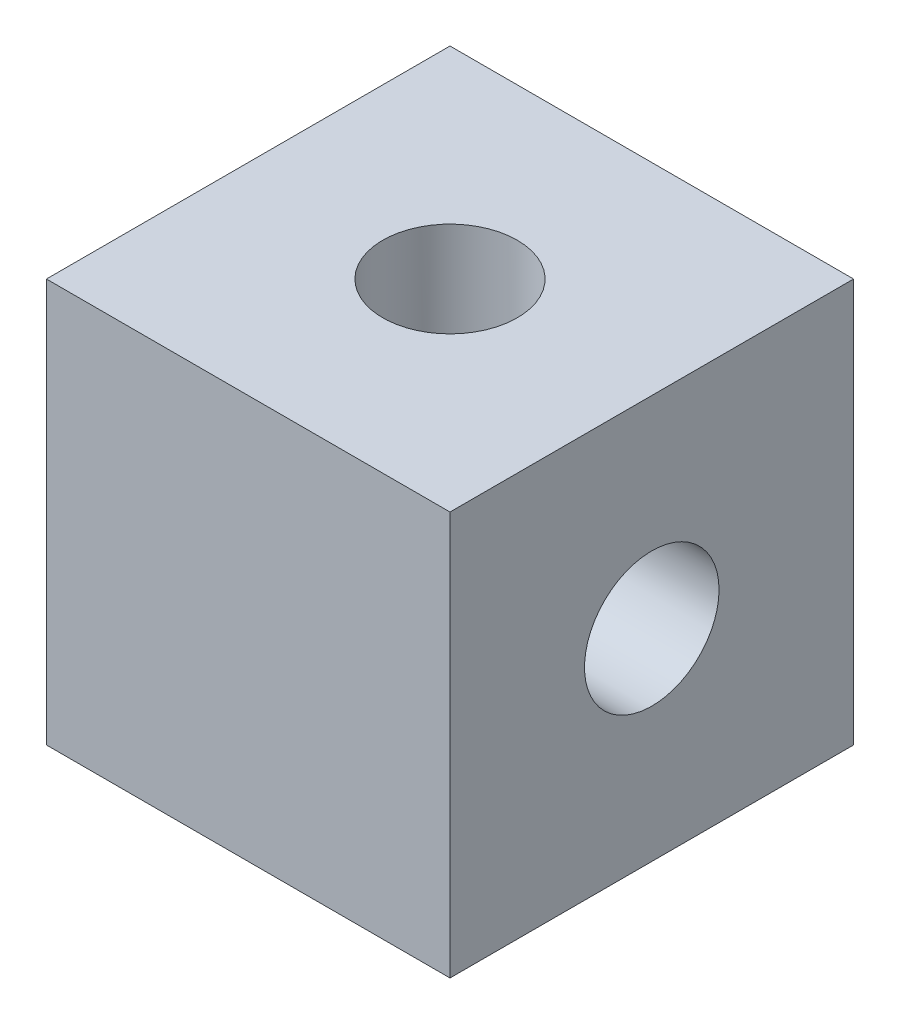
ISO-10303-21;
HEADER;
FILE_DESCRIPTION(('STEP AP214'),'2;1');
FILE_NAME('part.step','',(''),(''),'','','');
FILE_SCHEMA(('AUTOMOTIVE_DESIGN { 1 0 10303 214 1 1 1 1 }'));
ENDSEC;
DATA;
#1=APPLICATION_CONTEXT('core data for automotive mechanical design processes');
#2=APPLICATION_PROTOCOL_DEFINITION('international standard','automotive_design',2000,#1);
#3=PRODUCT_CONTEXT('',#1,'mechanical');
#4=PRODUCT('Part','Part','',(#3));
#5=PRODUCT_RELATED_PRODUCT_CATEGORY('part','',(#4));
#6=PRODUCT_DEFINITION_FORMATION('','',#4);
#7=PRODUCT_DEFINITION_CONTEXT('part definition',#1,'design');
#8=PRODUCT_DEFINITION('design','',#6,#7);
#9=PRODUCT_DEFINITION_SHAPE('','',#8);
#10=(LENGTH_UNIT() NAMED_UNIT(*) SI_UNIT(.MILLI.,.METRE.));
#11=(NAMED_UNIT(*) PLANE_ANGLE_UNIT() SI_UNIT($,.RADIAN.));
#12=(NAMED_UNIT(*) SI_UNIT($,.STERADIAN.) SOLID_ANGLE_UNIT());
#13=UNCERTAINTY_MEASURE_WITH_UNIT(LENGTH_MEASURE(1.E-05),#10,'distance_accuracy_value','');
#14=(GEOMETRIC_REPRESENTATION_CONTEXT(3) GLOBAL_UNCERTAINTY_ASSIGNED_CONTEXT((#13)) GLOBAL_UNIT_ASSIGNED_CONTEXT((#10,
#11,#12)) REPRESENTATION_CONTEXT('',''));
#15=CARTESIAN_POINT('',(0.,0.,0.));
#16=DIRECTION('',(0.,0.,1.));
#17=DIRECTION('',(1.,0.,0.));
#18=AXIS2_PLACEMENT_3D('',#15,#16,#17);
#19=CARTESIAN_POINT('',(0.,75.,0.));
#20=DIRECTION('',(0.,-1.,0.));
#21=DIRECTION('',(0.,0.,-1.));
#22=AXIS2_PLACEMENT_3D('',#19,#20,#21);
#23=CYLINDRICAL_SURFACE('',#22,12.5);
#24=CARTESIAN_POINT('',(0.,0.,0.));
#25=DIRECTION('',(0.,-1.,0.));
#26=DIRECTION('',(0.,0.,-1.));
#27=AXIS2_PLACEMENT_3D('',#24,#25,#26);
#28=CIRCLE('',#27,12.5);
#29=CARTESIAN_POINT('',(0.,0.,-12.5));
#30=VERTEX_POINT('',#29);
#31=EDGE_CURVE('E126',#30,#30,#28,.T.);
#32=ORIENTED_EDGE('',*,*,#31,.T.);
#33=EDGE_LOOP('',(#32));
#34=FACE_BOUND('',#33,.T.);
#35=CARTESIAN_POINT('',(0.,37.5,0.));
#36=DIRECTION('',(-0.707106781186547,-0.707106781186547,0.));
#37=DIRECTION('',(0.707106781186547,-0.707106781186547,0.));
#38=AXIS2_PLACEMENT_3D('',#35,#36,#37);
#39=ELLIPSE('',#38,17.6776695296637,12.5);
#40=CARTESIAN_POINT('',(0.,37.5,12.5));
#41=VERTEX_POINT('',#40);
#42=CARTESIAN_POINT('',(0.,37.5,-12.5));
#43=VERTEX_POINT('',#42);
#44=EDGE_CURVE('E47',#41,#43,#39,.F.);
#45=ORIENTED_EDGE('',*,*,#44,.T.);
#46=CARTESIAN_POINT('',(0.,37.5,0.));
#47=DIRECTION('',(0.707106781186547,-0.707106781186547,0.));
#48=DIRECTION('',(-0.707106781186547,-0.707106781186547,0.));
#49=AXIS2_PLACEMENT_3D('',#46,#47,#48);
#50=ELLIPSE('',#49,17.6776695296637,12.5);
#51=EDGE_CURVE('E11',#43,#41,#50,.F.);
#52=ORIENTED_EDGE('',*,*,#51,.T.);
#53=EDGE_LOOP('',(#45,#52));
#54=FACE_BOUND('',#53,.T.);
#55=ADVANCED_FACE('F34',(#34,#54),#23,.F.);
#56=CARTESIAN_POINT('',(-37.5,75.,37.5));
#57=DIRECTION('',(1.,0.,0.));
#58=DIRECTION('',(0.,0.,-1.));
#59=AXIS2_PLACEMENT_3D('',#56,#57,#58);
#60=PLANE('',#59);
#61=CARTESIAN_POINT('',(-37.5,37.5,0.));
#62=DIRECTION('',(1.,0.,0.));
#63=DIRECTION('',(0.,0.,-1.));
#64=AXIS2_PLACEMENT_3D('',#61,#62,#63);
#65=CIRCLE('',#64,12.5);
#66=CARTESIAN_POINT('',(-37.5,37.5,-12.5));
#67=VERTEX_POINT('',#66);
#68=EDGE_CURVE('E129',#67,#67,#65,.T.);
#69=ORIENTED_EDGE('',*,*,#68,.T.);
#70=EDGE_LOOP('',(#69));
#71=FACE_BOUND('',#70,.T.);
#72=DIRECTION('',(0.,0.,1.));
#73=VECTOR('',#72,1.);
#74=CARTESIAN_POINT('',(-37.5,0.,37.5));
#75=LINE('',#74,#73);
#76=CARTESIAN_POINT('',(-37.5,0.,-37.5));
#77=VERTEX_POINT('',#76);
#78=CARTESIAN_POINT('',(-37.5,0.,37.5));
#79=VERTEX_POINT('',#78);
#80=EDGE_CURVE('E117',#77,#79,#75,.T.);
#81=ORIENTED_EDGE('',*,*,#80,.T.);
#82=DIRECTION('',(0.,-1.,0.));
#83=VECTOR('',#82,1.);
#84=CARTESIAN_POINT('',(-37.5,75.,37.5));
#85=LINE('',#84,#83);
#86=CARTESIAN_POINT('',(-37.5,75.,37.5));
#87=VERTEX_POINT('',#86);
#88=EDGE_CURVE('E98',#87,#79,#85,.T.);
#89=ORIENTED_EDGE('',*,*,#88,.F.);
#90=DIRECTION('',(0.,0.,1.));
#91=VECTOR('',#90,1.);
#92=CARTESIAN_POINT('',(-37.5,75.,37.5));
#93=LINE('',#92,#91);
#94=CARTESIAN_POINT('',(-37.5,75.,-37.5));
#95=VERTEX_POINT('',#94);
#96=EDGE_CURVE('E112',#95,#87,#93,.T.);
#97=ORIENTED_EDGE('',*,*,#96,.F.);
#98=DIRECTION('',(0.,-1.,0.));
#99=VECTOR('',#98,1.);
#100=CARTESIAN_POINT('',(-37.5,75.,-37.5));
#101=LINE('',#100,#99);
#102=EDGE_CURVE('E109',#95,#77,#101,.T.);
#103=ORIENTED_EDGE('',*,*,#102,.T.);
#104=EDGE_LOOP('',(#81,#89,#97,#103));
#105=FACE_BOUND('',#104,.T.);
#106=ADVANCED_FACE('F36',(#71,#105),#60,.F.);
#107=CARTESIAN_POINT('',(-37.5,75.,37.5));
#108=DIRECTION('',(0.,0.,-1.));
#109=DIRECTION('',(-1.,0.,0.));
#110=AXIS2_PLACEMENT_3D('',#107,#108,#109);
#111=PLANE('',#110);
#112=DIRECTION('',(1.,0.,0.));
#113=VECTOR('',#112,1.);
#114=CARTESIAN_POINT('',(-37.5,0.,37.5));
#115=LINE('',#114,#113);
#116=CARTESIAN_POINT('',(37.5,0.,37.5));
#117=VERTEX_POINT('',#116);
#118=EDGE_CURVE('E115',#79,#117,#115,.T.);
#119=ORIENTED_EDGE('',*,*,#118,.T.);
#120=DIRECTION('',(0.,-1.,0.));
#121=VECTOR('',#120,1.);
#122=CARTESIAN_POINT('',(37.5,75.,37.5));
#123=LINE('',#122,#121);
#124=CARTESIAN_POINT('',(37.5,75.,37.5));
#125=VERTEX_POINT('',#124);
#126=EDGE_CURVE('E104',#125,#117,#123,.T.);
#127=ORIENTED_EDGE('',*,*,#126,.F.);
#128=DIRECTION('',(1.,0.,0.));
#129=VECTOR('',#128,1.);
#130=CARTESIAN_POINT('',(-37.5,75.,37.5));
#131=LINE('',#130,#129);
#132=EDGE_CURVE('E85',#87,#125,#131,.T.);
#133=ORIENTED_EDGE('',*,*,#132,.F.);
#134=ORIENTED_EDGE('',*,*,#88,.T.);
#135=EDGE_LOOP('',(#119,#127,#133,#134));
#136=FACE_BOUND('',#135,.T.);
#137=ADVANCED_FACE('F153',(#136),#111,.F.);
#138=CARTESIAN_POINT('',(37.5,75.,37.5));
#139=DIRECTION('',(-1.,0.,0.));
#140=DIRECTION('',(0.,0.,1.));
#141=AXIS2_PLACEMENT_3D('',#138,#139,#140);
#142=PLANE('',#141);
#143=CARTESIAN_POINT('',(37.5,37.5,0.));
#144=DIRECTION('',(1.,0.,0.));
#145=DIRECTION('',(0.,0.,-1.));
#146=AXIS2_PLACEMENT_3D('',#143,#144,#145);
#147=CIRCLE('',#146,12.5);
#148=CARTESIAN_POINT('',(37.5,37.5,-12.5));
#149=VERTEX_POINT('',#148);
#150=EDGE_CURVE('E132',#149,#149,#147,.T.);
#151=ORIENTED_EDGE('',*,*,#150,.F.);
#152=EDGE_LOOP('',(#151));
#153=FACE_BOUND('',#152,.T.);
#154=DIRECTION('',(0.,0.,-1.));
#155=VECTOR('',#154,1.);
#156=CARTESIAN_POINT('',(37.5,0.,37.5));
#157=LINE('',#156,#155);
#158=CARTESIAN_POINT('',(37.5,0.,-37.5));
#159=VERTEX_POINT('',#158);
#160=EDGE_CURVE('E113',#117,#159,#157,.T.);
#161=ORIENTED_EDGE('',*,*,#160,.T.);
#162=DIRECTION('',(0.,-1.,0.));
#163=VECTOR('',#162,1.);
#164=CARTESIAN_POINT('',(37.5,75.,-37.5));
#165=LINE('',#164,#163);
#166=CARTESIAN_POINT('',(37.5,75.,-37.5));
#167=VERTEX_POINT('',#166);
#168=EDGE_CURVE('E107',#167,#159,#165,.T.);
#169=ORIENTED_EDGE('',*,*,#168,.F.);
#170=DIRECTION('',(0.,0.,-1.));
#171=VECTOR('',#170,1.);
#172=CARTESIAN_POINT('',(37.5,75.,37.5));
#173=LINE('',#172,#171);
#174=EDGE_CURVE('E122',#125,#167,#173,.T.);
#175=ORIENTED_EDGE('',*,*,#174,.F.);
#176=ORIENTED_EDGE('',*,*,#126,.T.);
#177=EDGE_LOOP('',(#161,#169,#175,#176));
#178=FACE_BOUND('',#177,.T.);
#179=ADVANCED_FACE('F174',(#153,#178),#142,.F.);
#180=CARTESIAN_POINT('',(-37.5,75.,-37.5));
#181=DIRECTION('',(0.,0.,1.));
#182=DIRECTION('',(1.,0.,0.));
#183=AXIS2_PLACEMENT_3D('',#180,#181,#182);
#184=PLANE('',#183);
#185=DIRECTION('',(-1.,0.,0.));
#186=VECTOR('',#185,1.);
#187=CARTESIAN_POINT('',(-37.5,0.,-37.5));
#188=LINE('',#187,#186);
#189=EDGE_CURVE('E77',#159,#77,#188,.T.);
#190=ORIENTED_EDGE('',*,*,#189,.T.);
#191=ORIENTED_EDGE('',*,*,#102,.F.);
#192=DIRECTION('',(-1.,0.,0.));
#193=VECTOR('',#192,1.);
#194=CARTESIAN_POINT('',(-37.5,75.,-37.5));
#195=LINE('',#194,#193);
#196=EDGE_CURVE('E56',#167,#95,#195,.T.);
#197=ORIENTED_EDGE('',*,*,#196,.F.);
#198=ORIENTED_EDGE('',*,*,#168,.T.);
#199=EDGE_LOOP('',(#190,#191,#197,#198));
#200=FACE_BOUND('',#199,.T.);
#201=ADVANCED_FACE('F167',(#200),#184,.F.);
#202=CARTESIAN_POINT('',(0.,75.,0.));
#203=DIRECTION('',(0.,-1.,0.));
#204=DIRECTION('',(0.,0.,-1.));
#205=AXIS2_PLACEMENT_3D('',#202,#203,#204);
#206=PLANE('',#205);
#207=CARTESIAN_POINT('',(0.,75.,0.));
#208=DIRECTION('',(0.,-1.,0.));
#209=DIRECTION('',(0.,0.,-1.));
#210=AXIS2_PLACEMENT_3D('',#207,#208,#209);
#211=CIRCLE('',#210,12.5);
#212=CARTESIAN_POINT('',(0.,75.,-12.5));
#213=VERTEX_POINT('',#212);
#214=EDGE_CURVE('E120',#213,#213,#211,.T.);
#215=ORIENTED_EDGE('',*,*,#214,.T.);
#216=EDGE_LOOP('',(#215));
#217=FACE_BOUND('',#216,.T.);
#218=ORIENTED_EDGE('',*,*,#96,.T.);
#219=ORIENTED_EDGE('',*,*,#132,.T.);
#220=ORIENTED_EDGE('',*,*,#174,.T.);
#221=ORIENTED_EDGE('',*,*,#196,.T.);
#222=EDGE_LOOP('',(#218,#219,#220,#221));
#223=FACE_BOUND('',#222,.T.);
#224=ADVANCED_FACE('F162',(#217,#223),#206,.F.);
#225=CARTESIAN_POINT('',(0.,0.,0.));
#226=DIRECTION('',(0.,-1.,0.));
#227=DIRECTION('',(0.,0.,-1.));
#228=AXIS2_PLACEMENT_3D('',#225,#226,#227);
#229=PLANE('',#228);
#230=ORIENTED_EDGE('',*,*,#31,.F.);
#231=EDGE_LOOP('',(#230));
#232=FACE_BOUND('',#231,.T.);
#233=ORIENTED_EDGE('',*,*,#80,.F.);
#234=ORIENTED_EDGE('',*,*,#189,.F.);
#235=ORIENTED_EDGE('',*,*,#160,.F.);
#236=ORIENTED_EDGE('',*,*,#118,.F.);
#237=EDGE_LOOP('',(#233,#234,#235,#236));
#238=FACE_BOUND('',#237,.T.);
#239=ADVANCED_FACE('F156',(#232,#238),#229,.T.);
#240=CARTESIAN_POINT('',(0.,37.5,0.));
#241=DIRECTION('',(-0.707106781186547,-0.707106781186547,0.));
#242=DIRECTION('',(0.707106781186547,-0.707106781186547,0.));
#243=AXIS2_PLACEMENT_3D('',#240,#241,#242);
#244=ELLIPSE('',#243,17.6776695296637,12.5);
#245=EDGE_CURVE('E91',#41,#43,#244,.T.);
#246=ORIENTED_EDGE('',*,*,#245,.T.);
#247=CARTESIAN_POINT('',(0.,37.5,0.));
#248=DIRECTION('',(0.707106781186547,-0.707106781186547,0.));
#249=DIRECTION('',(-0.707106781186547,-0.707106781186547,0.));
#250=AXIS2_PLACEMENT_3D('',#247,#248,#249);
#251=ELLIPSE('',#250,17.6776695296637,12.5);
#252=EDGE_CURVE('E42',#43,#41,#251,.T.);
#253=ORIENTED_EDGE('',*,*,#252,.T.);
#254=EDGE_LOOP('',(#246,#253));
#255=FACE_BOUND('',#254,.T.);
#256=ORIENTED_EDGE('',*,*,#214,.F.);
#257=EDGE_LOOP('',(#256));
#258=FACE_BOUND('',#257,.T.);
#259=ADVANCED_FACE('F100',(#255,#258),#23,.F.);
#260=CARTESIAN_POINT('',(-37.5,37.5,0.));
#261=DIRECTION('',(1.,0.,0.));
#262=DIRECTION('',(0.,0.,-1.));
#263=AXIS2_PLACEMENT_3D('',#260,#261,#262);
#264=CYLINDRICAL_SURFACE('',#263,12.5);
#265=ORIENTED_EDGE('',*,*,#150,.T.);
#266=EDGE_LOOP('',(#265));
#267=FACE_BOUND('',#266,.T.);
#268=ORIENTED_EDGE('',*,*,#44,.F.);
#269=ORIENTED_EDGE('',*,*,#252,.F.);
#270=EDGE_LOOP('',(#268,#269));
#271=FACE_BOUND('',#270,.T.);
#272=ADVANCED_FACE('F97',(#267,#271),#264,.F.);
#273=ORIENTED_EDGE('',*,*,#68,.F.);
#274=EDGE_LOOP('',(#273));
#275=FACE_BOUND('',#274,.T.);
#276=ORIENTED_EDGE('',*,*,#245,.F.);
#277=ORIENTED_EDGE('',*,*,#51,.F.);
#278=EDGE_LOOP('',(#276,#277));
#279=FACE_BOUND('',#278,.T.);
#280=ADVANCED_FACE('F92',(#275,#279),#264,.F.);
#281=CLOSED_SHELL('',(#55,#106,#137,#179,#201,#224,#239,#259,#272,#280));
#282=MANIFOLD_SOLID_BREP('B2',#281);
#283=ADVANCED_BREP_SHAPE_REPRESENTATION('',(#18,#282),#14);
#284=SHAPE_DEFINITION_REPRESENTATION(#9,#283);
ENDSEC;
END-ISO-10303-21;
